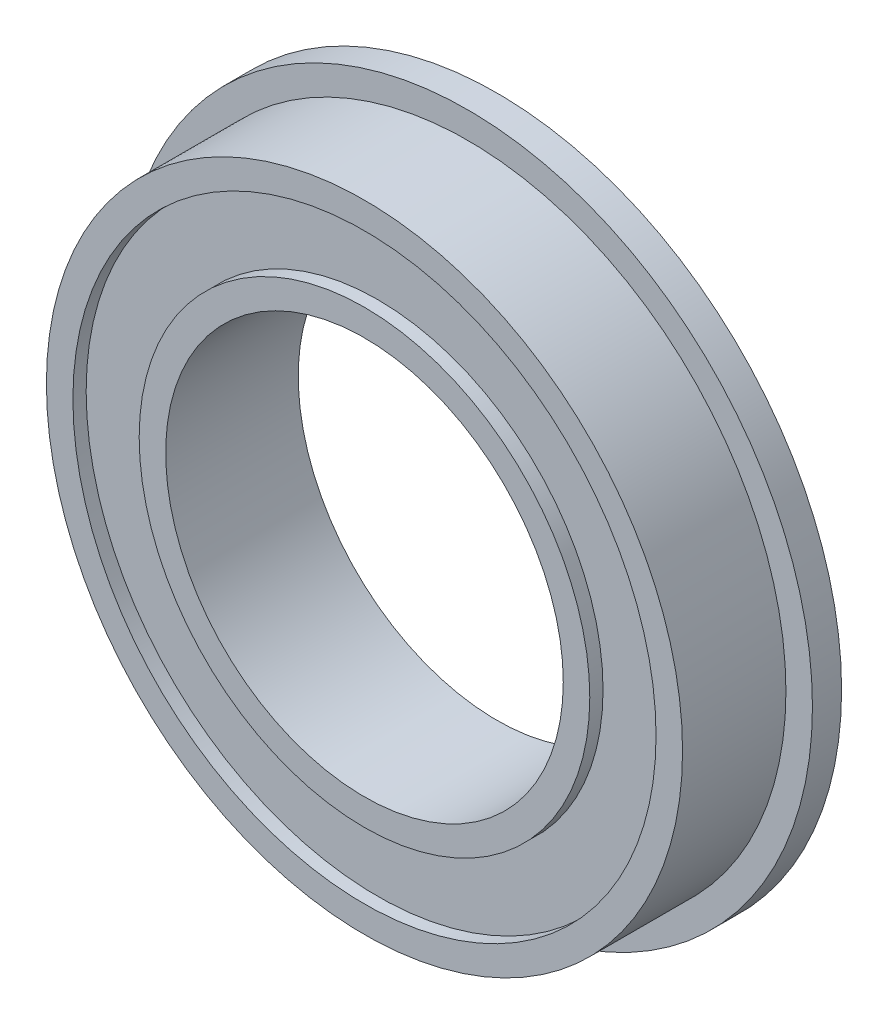
ISO-10303-21;
HEADER;
FILE_DESCRIPTION(('STEP AP214'),'2;1');
FILE_NAME('part.step','',(''),(''),'','','');
FILE_SCHEMA(('AUTOMOTIVE_DESIGN { 1 0 10303 214 1 1 1 1 }'));
ENDSEC;
DATA;
#1=APPLICATION_CONTEXT('core data for automotive mechanical design processes');
#2=APPLICATION_PROTOCOL_DEFINITION('international standard','automotive_design',2000,#1);
#3=PRODUCT_CONTEXT('',#1,'mechanical');
#4=PRODUCT('Part','Part','',(#3));
#5=PRODUCT_RELATED_PRODUCT_CATEGORY('part','',(#4));
#6=PRODUCT_DEFINITION_FORMATION('','',#4);
#7=PRODUCT_DEFINITION_CONTEXT('part definition',#1,'design');
#8=PRODUCT_DEFINITION('design','',#6,#7);
#9=PRODUCT_DEFINITION_SHAPE('','',#8);
#10=(LENGTH_UNIT() NAMED_UNIT(*) SI_UNIT(.MILLI.,.METRE.));
#11=(NAMED_UNIT(*) PLANE_ANGLE_UNIT() SI_UNIT($,.RADIAN.));
#12=(NAMED_UNIT(*) SI_UNIT($,.STERADIAN.) SOLID_ANGLE_UNIT());
#13=UNCERTAINTY_MEASURE_WITH_UNIT(LENGTH_MEASURE(1.E-05),#10,'distance_accuracy_value','');
#14=(GEOMETRIC_REPRESENTATION_CONTEXT(3) GLOBAL_UNCERTAINTY_ASSIGNED_CONTEXT((#13)) GLOBAL_UNIT_ASSIGNED_CONTEXT((#10,
#11,#12)) REPRESENTATION_CONTEXT('',''));
#15=CARTESIAN_POINT('',(0.,0.,0.));
#16=DIRECTION('',(0.,0.,1.));
#17=DIRECTION('',(1.,0.,0.));
#18=AXIS2_PLACEMENT_3D('',#15,#16,#17);
#19=CARTESIAN_POINT('',(0.,7.5,-5.));
#20=DIRECTION('',(0.,0.,1.));
#21=DIRECTION('',(1.,0.,0.));
#22=AXIS2_PLACEMENT_3D('',#19,#20,#21);
#23=PLANE('',#22);
#24=CARTESIAN_POINT('',(0.,0.,-5.));
#25=DIRECTION('',(0.,0.,1.));
#26=DIRECTION('',(1.,0.,0.));
#27=AXIS2_PLACEMENT_3D('',#24,#25,#26);
#28=CIRCLE('',#27,13.);
#29=CARTESIAN_POINT('',(13.,0.,-5.));
#30=VERTEX_POINT('',#29);
#31=EDGE_CURVE('E41',#30,#30,#28,.T.);
#32=ORIENTED_EDGE('',*,*,#31,.F.);
#33=EDGE_LOOP('',(#32));
#34=FACE_BOUND('',#33,.T.);
#35=CARTESIAN_POINT('',(0.,0.,-5.));
#36=DIRECTION('',(0.,0.,1.));
#37=DIRECTION('',(1.,0.,0.));
#38=AXIS2_PLACEMENT_3D('',#35,#36,#37);
#39=CIRCLE('',#38,11.);
#40=CARTESIAN_POINT('',(11.,0.,-5.));
#41=VERTEX_POINT('',#40);
#42=EDGE_CURVE('E77',#41,#41,#39,.T.);
#43=ORIENTED_EDGE('',*,*,#42,.T.);
#44=EDGE_LOOP('',(#43));
#45=FACE_BOUND('',#44,.T.);
#46=ADVANCED_FACE('F30',(#34,#45),#23,.F.);
#47=CARTESIAN_POINT('',(0.,0.,-5.));
#48=DIRECTION('',(0.,0.,1.));
#49=DIRECTION('',(1.,0.,0.));
#50=AXIS2_PLACEMENT_3D('',#47,#48,#49);
#51=CIRCLE('',#50,7.5);
#52=CARTESIAN_POINT('',(7.5,0.,-5.));
#53=VERTEX_POINT('',#52);
#54=EDGE_CURVE('E37',#53,#53,#51,.T.);
#55=ORIENTED_EDGE('',*,*,#54,.T.);
#56=EDGE_LOOP('',(#55));
#57=FACE_BOUND('',#56,.T.);
#58=CARTESIAN_POINT('',(0.,0.,-5.));
#59=DIRECTION('',(0.,0.,1.));
#60=DIRECTION('',(1.,0.,0.));
#61=AXIS2_PLACEMENT_3D('',#58,#59,#60);
#62=CIRCLE('',#61,8.5);
#63=CARTESIAN_POINT('',(8.5,0.,-5.));
#64=VERTEX_POINT('',#63);
#65=EDGE_CURVE('E74',#64,#64,#62,.T.);
#66=ORIENTED_EDGE('',*,*,#65,.F.);
#67=EDGE_LOOP('',(#66));
#68=FACE_BOUND('',#67,.T.);
#69=ADVANCED_FACE('F99',(#57,#68),#23,.F.);
#70=CARTESIAN_POINT('',(0.,12.,0.));
#71=DIRECTION('',(0.,0.,-1.));
#72=DIRECTION('',(-1.,0.,0.));
#73=AXIS2_PLACEMENT_3D('',#70,#71,#72);
#74=PLANE('',#73);
#75=CARTESIAN_POINT('',(0.,0.,0.));
#76=DIRECTION('',(0.,0.,1.));
#77=DIRECTION('',(1.,0.,0.));
#78=AXIS2_PLACEMENT_3D('',#75,#76,#77);
#79=CIRCLE('',#78,7.5);
#80=CARTESIAN_POINT('',(7.5,0.,0.));
#81=VERTEX_POINT('',#80);
#82=EDGE_CURVE('E10',#81,#81,#79,.T.);
#83=ORIENTED_EDGE('',*,*,#82,.F.);
#84=EDGE_LOOP('',(#83));
#85=FACE_BOUND('',#84,.T.);
#86=CARTESIAN_POINT('',(0.,0.,0.));
#87=DIRECTION('',(0.,0.,1.));
#88=DIRECTION('',(1.,0.,0.));
#89=AXIS2_PLACEMENT_3D('',#86,#87,#88);
#90=CIRCLE('',#89,8.5);
#91=CARTESIAN_POINT('',(8.5,0.,0.));
#92=VERTEX_POINT('',#91);
#93=EDGE_CURVE('E56',#92,#92,#90,.T.);
#94=ORIENTED_EDGE('',*,*,#93,.T.);
#95=EDGE_LOOP('',(#94));
#96=FACE_BOUND('',#95,.T.);
#97=ADVANCED_FACE('F32',(#85,#96),#74,.F.);
#98=CARTESIAN_POINT('',(0.,0.,0.));
#99=DIRECTION('',(0.,0.,1.));
#100=DIRECTION('',(1.,0.,0.));
#101=AXIS2_PLACEMENT_3D('',#98,#99,#100);
#102=CIRCLE('',#101,12.);
#103=CARTESIAN_POINT('',(12.,0.,0.));
#104=VERTEX_POINT('',#103);
#105=EDGE_CURVE('E53',#104,#104,#102,.T.);
#106=ORIENTED_EDGE('',*,*,#105,.T.);
#107=EDGE_LOOP('',(#106));
#108=FACE_BOUND('',#107,.T.);
#109=CARTESIAN_POINT('',(0.,0.,0.));
#110=DIRECTION('',(0.,0.,1.));
#111=DIRECTION('',(1.,0.,0.));
#112=AXIS2_PLACEMENT_3D('',#109,#110,#111);
#113=CIRCLE('',#112,11.);
#114=CARTESIAN_POINT('',(11.,0.,0.));
#115=VERTEX_POINT('',#114);
#116=EDGE_CURVE('E65',#115,#115,#113,.T.);
#117=ORIENTED_EDGE('',*,*,#116,.F.);
#118=EDGE_LOOP('',(#117));
#119=FACE_BOUND('',#118,.T.);
#120=ADVANCED_FACE('F111',(#108,#119),#74,.F.);
#121=CARTESIAN_POINT('',(0.,0.,0.));
#122=DIRECTION('',(0.,0.,1.));
#123=DIRECTION('',(1.,0.,0.));
#124=AXIS2_PLACEMENT_3D('',#121,#122,#123);
#125=CYLINDRICAL_SURFACE('',#124,7.5);
#126=ORIENTED_EDGE('',*,*,#54,.F.);
#127=EDGE_LOOP('',(#126));
#128=FACE_BOUND('',#127,.T.);
#129=ORIENTED_EDGE('',*,*,#82,.T.);
#130=EDGE_LOOP('',(#129));
#131=FACE_BOUND('',#130,.T.);
#132=ADVANCED_FACE('F109',(#128,#131),#125,.F.);
#133=CARTESIAN_POINT('',(0.,0.,0.));
#134=DIRECTION('',(0.,0.,1.));
#135=DIRECTION('',(1.,0.,0.));
#136=AXIS2_PLACEMENT_3D('',#133,#134,#135);
#137=CYLINDRICAL_SURFACE('',#136,13.);
#138=CARTESIAN_POINT('',(0.,0.,-3.9));
#139=DIRECTION('',(0.,0.,1.));
#140=DIRECTION('',(1.,0.,0.));
#141=AXIS2_PLACEMENT_3D('',#138,#139,#140);
#142=CIRCLE('',#141,13.);
#143=CARTESIAN_POINT('',(13.,0.,-3.9));
#144=VERTEX_POINT('',#143);
#145=EDGE_CURVE('E45',#144,#144,#142,.T.);
#146=ORIENTED_EDGE('',*,*,#145,.F.);
#147=EDGE_LOOP('',(#146));
#148=FACE_BOUND('',#147,.T.);
#149=ORIENTED_EDGE('',*,*,#31,.T.);
#150=EDGE_LOOP('',(#149));
#151=FACE_BOUND('',#150,.T.);
#152=ADVANCED_FACE('F107',(#148,#151),#137,.T.);
#153=CARTESIAN_POINT('',(0.,13.,-3.9));
#154=DIRECTION('',(0.,0.,-1.));
#155=DIRECTION('',(-1.,0.,0.));
#156=AXIS2_PLACEMENT_3D('',#153,#154,#155);
#157=PLANE('',#156);
#158=CARTESIAN_POINT('',(0.,0.,-3.9));
#159=DIRECTION('',(0.,0.,1.));
#160=DIRECTION('',(1.,0.,0.));
#161=AXIS2_PLACEMENT_3D('',#158,#159,#160);
#162=CIRCLE('',#161,12.);
#163=CARTESIAN_POINT('',(12.,0.,-3.9));
#164=VERTEX_POINT('',#163);
#165=EDGE_CURVE('E50',#164,#164,#162,.T.);
#166=ORIENTED_EDGE('',*,*,#165,.F.);
#167=EDGE_LOOP('',(#166));
#168=FACE_BOUND('',#167,.T.);
#169=ORIENTED_EDGE('',*,*,#145,.T.);
#170=EDGE_LOOP('',(#169));
#171=FACE_BOUND('',#170,.T.);
#172=ADVANCED_FACE('F117',(#168,#171),#157,.F.);
#173=CARTESIAN_POINT('',(0.,0.,0.));
#174=DIRECTION('',(0.,0.,1.));
#175=DIRECTION('',(1.,0.,0.));
#176=AXIS2_PLACEMENT_3D('',#173,#174,#175);
#177=CYLINDRICAL_SURFACE('',#176,12.);
#178=ORIENTED_EDGE('',*,*,#105,.F.);
#179=EDGE_LOOP('',(#178));
#180=FACE_BOUND('',#179,.T.);
#181=ORIENTED_EDGE('',*,*,#165,.T.);
#182=EDGE_LOOP('',(#181));
#183=FACE_BOUND('',#182,.T.);
#184=ADVANCED_FACE('F138',(#180,#183),#177,.T.);
#185=CARTESIAN_POINT('',(0.,0.,0.));
#186=DIRECTION('',(0.,0.,1.));
#187=DIRECTION('',(1.,0.,0.));
#188=AXIS2_PLACEMENT_3D('',#185,#186,#187);
#189=CYLINDRICAL_SURFACE('',#188,8.5);
#190=CARTESIAN_POINT('',(0.,0.,-0.500000000000001));
#191=DIRECTION('',(0.,0.,1.));
#192=DIRECTION('',(1.,0.,0.));
#193=AXIS2_PLACEMENT_3D('',#190,#191,#192);
#194=CIRCLE('',#193,8.5);
#195=CARTESIAN_POINT('',(8.5,0.,-0.500000000000001));
#196=VERTEX_POINT('',#195);
#197=EDGE_CURVE('E59',#196,#196,#194,.T.);
#198=ORIENTED_EDGE('',*,*,#197,.T.);
#199=EDGE_LOOP('',(#198));
#200=FACE_BOUND('',#199,.T.);
#201=ORIENTED_EDGE('',*,*,#93,.F.);
#202=EDGE_LOOP('',(#201));
#203=FACE_BOUND('',#202,.T.);
#204=ADVANCED_FACE('F132',(#200,#203),#189,.T.);
#205=CARTESIAN_POINT('',(0.,11.,-0.500000000000001));
#206=DIRECTION('',(0.,0.,1.));
#207=DIRECTION('',(1.,0.,0.));
#208=AXIS2_PLACEMENT_3D('',#205,#206,#207);
#209=PLANE('',#208);
#210=CARTESIAN_POINT('',(0.,0.,-0.500000000000001));
#211=DIRECTION('',(0.,0.,1.));
#212=DIRECTION('',(1.,0.,0.));
#213=AXIS2_PLACEMENT_3D('',#210,#211,#212);
#214=CIRCLE('',#213,11.);
#215=CARTESIAN_POINT('',(11.,0.,-0.500000000000001));
#216=VERTEX_POINT('',#215);
#217=EDGE_CURVE('E62',#216,#216,#214,.T.);
#218=ORIENTED_EDGE('',*,*,#217,.T.);
#219=EDGE_LOOP('',(#218));
#220=FACE_BOUND('',#219,.T.);
#221=ORIENTED_EDGE('',*,*,#197,.F.);
#222=EDGE_LOOP('',(#221));
#223=FACE_BOUND('',#222,.T.);
#224=ADVANCED_FACE('F95',(#220,#223),#209,.T.);
#225=CARTESIAN_POINT('',(0.,0.,0.));
#226=DIRECTION('',(0.,0.,1.));
#227=DIRECTION('',(1.,0.,0.));
#228=AXIS2_PLACEMENT_3D('',#225,#226,#227);
#229=CYLINDRICAL_SURFACE('',#228,11.);
#230=ORIENTED_EDGE('',*,*,#116,.T.);
#231=EDGE_LOOP('',(#230));
#232=FACE_BOUND('',#231,.T.);
#233=ORIENTED_EDGE('',*,*,#217,.F.);
#234=EDGE_LOOP('',(#233));
#235=FACE_BOUND('',#234,.T.);
#236=ADVANCED_FACE('F85',(#232,#235),#229,.F.);
#237=CARTESIAN_POINT('',(0.,0.,0.));
#238=DIRECTION('',(0.,0.,1.));
#239=DIRECTION('',(1.,0.,0.));
#240=AXIS2_PLACEMENT_3D('',#237,#238,#239);
#241=CYLINDRICAL_SURFACE('',#240,11.);
#242=CARTESIAN_POINT('',(0.,0.,-4.5));
#243=DIRECTION('',(0.,0.,1.));
#244=DIRECTION('',(1.,0.,0.));
#245=AXIS2_PLACEMENT_3D('',#242,#243,#244);
#246=CIRCLE('',#245,11.);
#247=CARTESIAN_POINT('',(11.,0.,-4.5));
#248=VERTEX_POINT('',#247);
#249=EDGE_CURVE('E68',#248,#248,#246,.T.);
#250=ORIENTED_EDGE('',*,*,#249,.T.);
#251=EDGE_LOOP('',(#250));
#252=FACE_BOUND('',#251,.T.);
#253=ORIENTED_EDGE('',*,*,#42,.F.);
#254=EDGE_LOOP('',(#253));
#255=FACE_BOUND('',#254,.T.);
#256=ADVANCED_FACE('F82',(#252,#255),#241,.F.);
#257=CARTESIAN_POINT('',(0.,11.,-4.5));
#258=DIRECTION('',(0.,0.,-1.));
#259=DIRECTION('',(-1.,0.,0.));
#260=AXIS2_PLACEMENT_3D('',#257,#258,#259);
#261=PLANE('',#260);
#262=CARTESIAN_POINT('',(0.,0.,-4.5));
#263=DIRECTION('',(0.,0.,1.));
#264=DIRECTION('',(1.,0.,0.));
#265=AXIS2_PLACEMENT_3D('',#262,#263,#264);
#266=CIRCLE('',#265,8.5);
#267=CARTESIAN_POINT('',(8.5,0.,-4.5));
#268=VERTEX_POINT('',#267);
#269=EDGE_CURVE('E71',#268,#268,#266,.T.);
#270=ORIENTED_EDGE('',*,*,#269,.T.);
#271=EDGE_LOOP('',(#270));
#272=FACE_BOUND('',#271,.T.);
#273=ORIENTED_EDGE('',*,*,#249,.F.);
#274=EDGE_LOOP('',(#273));
#275=FACE_BOUND('',#274,.T.);
#276=ADVANCED_FACE('F84',(#272,#275),#261,.T.);
#277=CARTESIAN_POINT('',(0.,0.,0.));
#278=DIRECTION('',(0.,0.,1.));
#279=DIRECTION('',(1.,0.,0.));
#280=AXIS2_PLACEMENT_3D('',#277,#278,#279);
#281=CYLINDRICAL_SURFACE('',#280,8.5);
#282=ORIENTED_EDGE('',*,*,#65,.T.);
#283=EDGE_LOOP('',(#282));
#284=FACE_BOUND('',#283,.T.);
#285=ORIENTED_EDGE('',*,*,#269,.F.);
#286=EDGE_LOOP('',(#285));
#287=FACE_BOUND('',#286,.T.);
#288=ADVANCED_FACE('F92',(#284,#287),#281,.T.);
#289=CLOSED_SHELL('',(#46,#69,#97,#120,#132,#152,#172,#184,#204,#224,#236,#256,#276,#288));
#290=MANIFOLD_SOLID_BREP('B2',#289);
#291=ADVANCED_BREP_SHAPE_REPRESENTATION('',(#18,#290),#14);
#292=SHAPE_DEFINITION_REPRESENTATION(#9,#291);
ENDSEC;
END-ISO-10303-21;
